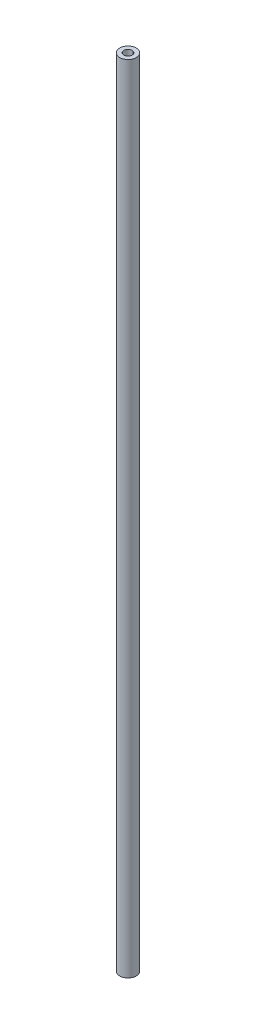
ISO-10303-21;
HEADER;
FILE_DESCRIPTION(('STEP AP214'),'2;1');
FILE_NAME('part.step','',(''),(''),'','','');
FILE_SCHEMA(('AUTOMOTIVE_DESIGN { 1 0 10303 214 1 1 1 1 }'));
ENDSEC;
DATA;
#1=APPLICATION_CONTEXT('core data for automotive mechanical design processes');
#2=APPLICATION_PROTOCOL_DEFINITION('international standard','automotive_design',2000,#1);
#3=PRODUCT_CONTEXT('',#1,'mechanical');
#4=PRODUCT('Part','Part','',(#3));
#5=PRODUCT_RELATED_PRODUCT_CATEGORY('part','',(#4));
#6=PRODUCT_DEFINITION_FORMATION('','',#4);
#7=PRODUCT_DEFINITION_CONTEXT('part definition',#1,'design');
#8=PRODUCT_DEFINITION('design','',#6,#7);
#9=PRODUCT_DEFINITION_SHAPE('','',#8);
#10=(LENGTH_UNIT() NAMED_UNIT(*) SI_UNIT(.MILLI.,.METRE.));
#11=(NAMED_UNIT(*) PLANE_ANGLE_UNIT() SI_UNIT($,.RADIAN.));
#12=(NAMED_UNIT(*) SI_UNIT($,.STERADIAN.) SOLID_ANGLE_UNIT());
#13=UNCERTAINTY_MEASURE_WITH_UNIT(LENGTH_MEASURE(1.E-05),#10,'distance_accuracy_value','');
#14=(GEOMETRIC_REPRESENTATION_CONTEXT(3) GLOBAL_UNCERTAINTY_ASSIGNED_CONTEXT((#13)) GLOBAL_UNIT_ASSIGNED_CONTEXT((#10,
#11,#12)) REPRESENTATION_CONTEXT('',''));
#15=CARTESIAN_POINT('',(0.,0.,0.));
#16=DIRECTION('',(0.,0.,1.));
#17=DIRECTION('',(1.,0.,0.));
#18=AXIS2_PLACEMENT_3D('',#15,#16,#17);
#19=CARTESIAN_POINT('',(0.,609.6,0.));
#20=DIRECTION('',(0.,-1.,0.));
#21=DIRECTION('',(0.,0.,-1.));
#22=AXIS2_PLACEMENT_3D('',#19,#20,#21);
#23=CYLINDRICAL_SURFACE('',#22,6.35);
#24=CARTESIAN_POINT('',(0.,609.6,0.));
#25=DIRECTION('',(0.,1.,0.));
#26=DIRECTION('',(0.,0.,1.));
#27=AXIS2_PLACEMENT_3D('',#24,#25,#26);
#28=CIRCLE('',#27,6.35);
#29=CARTESIAN_POINT('',(0.,609.6,-6.35));
#30=VERTEX_POINT('',#29);
#31=EDGE_CURVE('E10',#30,#30,#28,.T.);
#32=CARTESIAN_POINT('',(0.,0.,0.));
#33=DIRECTION('',(0.,1.,0.));
#34=DIRECTION('',(0.,0.,1.));
#35=AXIS2_PLACEMENT_3D('',#32,#33,#34);
#36=CIRCLE('',#35,6.35);
#37=CARTESIAN_POINT('',(0.,0.,-6.35));
#38=VERTEX_POINT('',#37);
#39=EDGE_CURVE('E36',#38,#38,#36,.T.);
#40=CARTESIAN_POINT('',(0.,609.6,-6.35));
#41=CARTESIAN_POINT('',(0.,603.25,-6.35));
#42=CARTESIAN_POINT('',(0.,596.9,-6.35));
#43=CARTESIAN_POINT('',(0.,584.2,-6.35));
#44=CARTESIAN_POINT('',(0.,577.85,-6.35));
#45=CARTESIAN_POINT('',(0.,565.15,-6.35));
#46=CARTESIAN_POINT('',(0.,558.8,-6.35));
#47=CARTESIAN_POINT('',(0.,546.1,-6.35));
#48=CARTESIAN_POINT('',(0.,539.75,-6.35));
#49=CARTESIAN_POINT('',(0.,527.05,-6.35));
#50=CARTESIAN_POINT('',(0.,520.7,-6.35));
#51=CARTESIAN_POINT('',(0.,508.,-6.35));
#52=CARTESIAN_POINT('',(0.,501.65,-6.35));
#53=CARTESIAN_POINT('',(0.,488.95,-6.35));
#54=CARTESIAN_POINT('',(0.,482.6,-6.35));
#55=CARTESIAN_POINT('',(0.,469.9,-6.35));
#56=CARTESIAN_POINT('',(0.,463.55,-6.35));
#57=CARTESIAN_POINT('',(0.,450.85,-6.35));
#58=CARTESIAN_POINT('',(0.,444.5,-6.35));
#59=CARTESIAN_POINT('',(0.,431.8,-6.35));
#60=CARTESIAN_POINT('',(0.,425.45,-6.35));
#61=CARTESIAN_POINT('',(0.,412.75,-6.35));
#62=CARTESIAN_POINT('',(0.,406.4,-6.35));
#63=CARTESIAN_POINT('',(0.,393.7,-6.35));
#64=CARTESIAN_POINT('',(0.,387.35,-6.35));
#65=CARTESIAN_POINT('',(0.,374.65,-6.35));
#66=CARTESIAN_POINT('',(0.,368.3,-6.35));
#67=CARTESIAN_POINT('',(0.,355.6,-6.35));
#68=CARTESIAN_POINT('',(0.,349.25,-6.35));
#69=CARTESIAN_POINT('',(0.,336.55,-6.35));
#70=CARTESIAN_POINT('',(0.,330.2,-6.35));
#71=CARTESIAN_POINT('',(0.,317.5,-6.35));
#72=CARTESIAN_POINT('',(0.,311.15,-6.35));
#73=CARTESIAN_POINT('',(0.,298.45,-6.35));
#74=CARTESIAN_POINT('',(0.,292.1,-6.35));
#75=CARTESIAN_POINT('',(0.,279.4,-6.35));
#76=CARTESIAN_POINT('',(0.,273.05,-6.35));
#77=CARTESIAN_POINT('',(0.,260.35,-6.35));
#78=CARTESIAN_POINT('',(0.,254.,-6.35));
#79=CARTESIAN_POINT('',(0.,241.3,-6.35));
#80=CARTESIAN_POINT('',(0.,234.95,-6.35));
#81=CARTESIAN_POINT('',(0.,222.25,-6.35));
#82=CARTESIAN_POINT('',(0.,215.9,-6.35));
#83=CARTESIAN_POINT('',(0.,203.2,-6.35));
#84=CARTESIAN_POINT('',(0.,196.85,-6.35));
#85=CARTESIAN_POINT('',(0.,184.15,-6.35));
#86=CARTESIAN_POINT('',(0.,177.8,-6.35));
#87=CARTESIAN_POINT('',(0.,165.1,-6.35));
#88=CARTESIAN_POINT('',(0.,158.75,-6.35));
#89=CARTESIAN_POINT('',(0.,146.05,-6.35));
#90=CARTESIAN_POINT('',(0.,139.7,-6.35));
#91=CARTESIAN_POINT('',(0.,127.,-6.35));
#92=CARTESIAN_POINT('',(0.,120.65,-6.35));
#93=CARTESIAN_POINT('',(0.,107.95,-6.35));
#94=CARTESIAN_POINT('',(0.,101.6,-6.35));
#95=CARTESIAN_POINT('',(0.,88.9,-6.35));
#96=CARTESIAN_POINT('',(0.,82.5500000000001,-6.35));
#97=CARTESIAN_POINT('',(0.,69.85,-6.35));
#98=CARTESIAN_POINT('',(0.,63.5,-6.35));
#99=CARTESIAN_POINT('',(0.,50.8,-6.35));
#100=CARTESIAN_POINT('',(0.,44.45,-6.35));
#101=CARTESIAN_POINT('',(0.,31.75,-6.35));
#102=CARTESIAN_POINT('',(0.,25.4,-6.35));
#103=CARTESIAN_POINT('',(0.,12.7,-6.35));
#104=CARTESIAN_POINT('',(0.,6.35000000000001,-6.35));
#105=CARTESIAN_POINT('',(0.,0.,-6.35));
#106=B_SPLINE_CURVE_WITH_KNOTS('',3,(#40,#41,#42,#43,#44,#45,#46,#47,#48,#49,#50,#51,#52,#53,
#54,#55,#56,#57,#58,#59,#60,#61,#62,#63,#64,#65,#66,#67,#68,#69,#70,#71,#72,#73,#74,#75,#76,#77,
#78,#79,#80,#81,#82,#83,#84,#85,#86,#87,#88,#89,#90,#91,#92,#93,#94,#95,#96,#97,#98,#99,#100,
#101,#102,#103,#104,#105),.UNSPECIFIED.,.F.,.F.,(4,2,2,2,2,2,2,2,2,2,2,2,2,2,2,2,2,2,2,2,2,2,2,
2,2,2,2,2,2,2,2,2,4),(0.,19.0499999999999,38.0999999999999,57.1499999999999,76.1999999999999,
95.2499999999999,114.3,133.35,152.4,171.45,190.5,209.55,228.6,247.65,266.7,285.75,304.8,323.85,
342.9,361.95,381.,400.05,419.1,438.15,457.2,476.25,495.3,514.35,533.4,552.45,571.5,590.55,
609.6),.UNSPECIFIED.);
#107=EDGE_CURVE('BSEAM33',#30,#38,#106,.T.);
#108=ORIENTED_EDGE('',*,*,#31,.F.);
#109=ORIENTED_EDGE('',*,*,#39,.T.);
#110=ORIENTED_EDGE('',*,*,#107,.T.);
#111=ORIENTED_EDGE('',*,*,#107,.F.);
#112=EDGE_LOOP('',(#108,#110,#109,#111));
#113=FACE_BOUND('',#112,.T.);
#114=ADVANCED_FACE('F33',(#113),#23,.T.);
#115=CARTESIAN_POINT('',(0.,609.6,0.));
#116=DIRECTION('',(0.,1.,0.));
#117=DIRECTION('',(0.,0.,1.));
#118=AXIS2_PLACEMENT_3D('',#115,#116,#117);
#119=PLANE('',#118);
#120=CARTESIAN_POINT('',(0.,609.6,0.));
#121=DIRECTION('',(0.,1.,0.));
#122=DIRECTION('',(0.,0.,1.));
#123=AXIS2_PLACEMENT_3D('',#120,#121,#122);
#124=CIRCLE('',#123,3.175);
#125=CARTESIAN_POINT('',(0.,609.6,3.175));
#126=VERTEX_POINT('',#125);
#127=EDGE_CURVE('E47',#126,#126,#124,.T.);
#128=ORIENTED_EDGE('',*,*,#127,.F.);
#129=EDGE_LOOP('',(#128));
#130=FACE_BOUND('',#129,.T.);
#131=ORIENTED_EDGE('',*,*,#31,.T.);
#132=EDGE_LOOP('',(#131));
#133=FACE_BOUND('',#132,.T.);
#134=ADVANCED_FACE('F54',(#130,#133),#119,.T.);
#135=CARTESIAN_POINT('',(0.,0.,0.));
#136=DIRECTION('',(0.,1.,0.));
#137=DIRECTION('',(0.,0.,1.));
#138=AXIS2_PLACEMENT_3D('',#135,#136,#137);
#139=PLANE('',#138);
#140=CARTESIAN_POINT('',(0.,0.,0.));
#141=DIRECTION('',(0.,1.,0.));
#142=DIRECTION('',(0.,0.,1.));
#143=AXIS2_PLACEMENT_3D('',#140,#141,#142);
#144=CIRCLE('',#143,3.175);
#145=CARTESIAN_POINT('',(0.,0.,3.175));
#146=VERTEX_POINT('',#145);
#147=EDGE_CURVE('E43',#146,#146,#144,.F.);
#148=ORIENTED_EDGE('',*,*,#147,.F.);
#149=EDGE_LOOP('',(#148));
#150=FACE_BOUND('',#149,.T.);
#151=ORIENTED_EDGE('',*,*,#39,.F.);
#152=EDGE_LOOP('',(#151));
#153=FACE_BOUND('',#152,.T.);
#154=ADVANCED_FACE('F56',(#150,#153),#139,.F.);
#155=CARTESIAN_POINT('',(0.,-0.00100000000002876,0.));
#156=DIRECTION('',(0.,1.,0.));
#157=DIRECTION('',(0.,0.,1.));
#158=AXIS2_PLACEMENT_3D('',#155,#156,#157);
#159=CYLINDRICAL_SURFACE('',#158,3.175);
#160=ORIENTED_EDGE('',*,*,#127,.T.);
#161=EDGE_LOOP('',(#160));
#162=FACE_BOUND('',#161,.T.);
#163=ORIENTED_EDGE('',*,*,#147,.T.);
#164=EDGE_LOOP('',(#163));
#165=FACE_BOUND('',#164,.T.);
#166=ADVANCED_FACE('F51',(#162,#165),#159,.F.);
#167=CLOSED_SHELL('',(#114,#134,#154,#166));
#168=MANIFOLD_SOLID_BREP('B2',#167);
#169=ADVANCED_BREP_SHAPE_REPRESENTATION('',(#18,#168),#14);
#170=SHAPE_DEFINITION_REPRESENTATION(#9,#169);
ENDSEC;
END-ISO-10303-21;
